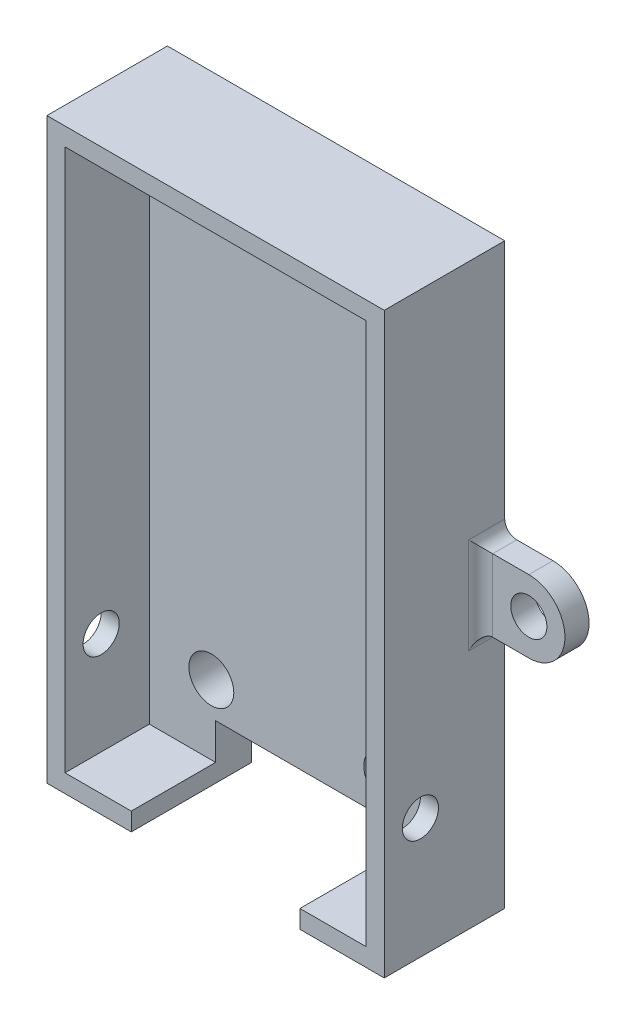
ISO-10303-21;
HEADER;
FILE_DESCRIPTION(('STEP AP214'),'2;1');
FILE_NAME('part.step','',(''),(''),'','','');
FILE_SCHEMA(('AUTOMOTIVE_DESIGN { 1 0 10303 214 1 1 1 1 }'));
ENDSEC;
DATA;
#1=APPLICATION_CONTEXT('core data for automotive mechanical design processes');
#2=APPLICATION_PROTOCOL_DEFINITION('international standard','automotive_design',2000,#1);
#3=PRODUCT_CONTEXT('',#1,'mechanical');
#4=PRODUCT('Part','Part','',(#3));
#5=PRODUCT_RELATED_PRODUCT_CATEGORY('part','',(#4));
#6=PRODUCT_DEFINITION_FORMATION('','',#4);
#7=PRODUCT_DEFINITION_CONTEXT('part definition',#1,'design');
#8=PRODUCT_DEFINITION('design','',#6,#7);
#9=PRODUCT_DEFINITION_SHAPE('','',#8);
#10=(LENGTH_UNIT() NAMED_UNIT(*) SI_UNIT(.MILLI.,.METRE.));
#11=(NAMED_UNIT(*) PLANE_ANGLE_UNIT() SI_UNIT($,.RADIAN.));
#12=(NAMED_UNIT(*) SI_UNIT($,.STERADIAN.) SOLID_ANGLE_UNIT());
#13=UNCERTAINTY_MEASURE_WITH_UNIT(LENGTH_MEASURE(1.E-05),#10,'distance_accuracy_value','');
#14=(GEOMETRIC_REPRESENTATION_CONTEXT(3) GLOBAL_UNCERTAINTY_ASSIGNED_CONTEXT((#13)) GLOBAL_UNIT_ASSIGNED_CONTEXT((#10,
#11,#12)) REPRESENTATION_CONTEXT('',''));
#15=CARTESIAN_POINT('',(0.,0.,0.));
#16=DIRECTION('',(0.,0.,1.));
#17=DIRECTION('',(1.,0.,0.));
#18=AXIS2_PLACEMENT_3D('',#15,#16,#17);
#19=CARTESIAN_POINT('',(0.,0.,3.));
#20=DIRECTION('',(0.,0.,1.));
#21=DIRECTION('',(1.,0.,0.));
#22=AXIS2_PLACEMENT_3D('',#19,#20,#21);
#23=PLANE('',#22);
#24=CARTESIAN_POINT('',(-7.14290536702838,18.0559536422497,3.));
#25=DIRECTION('',(0.,0.,1.));
#26=DIRECTION('',(1.,0.,0.));
#27=AXIS2_PLACEMENT_3D('',#24,#25,#26);
#28=CIRCLE('',#27,1.93973789939432);
#29=CARTESIAN_POINT('',(-5.20316746763407,18.0559536422497,3.));
#30=VERTEX_POINT('',#29);
#31=EDGE_CURVE('E399',#30,#30,#28,.T.);
#32=ORIENTED_EDGE('',*,*,#31,.F.);
#33=EDGE_LOOP('',(#32));
#34=FACE_BOUND('',#33,.T.);
#35=CARTESIAN_POINT('',(-7.35443169670674,-16.736502832513,3.));
#36=DIRECTION('',(0.,0.,1.));
#37=DIRECTION('',(1.,0.,0.));
#38=AXIS2_PLACEMENT_3D('',#35,#36,#37);
#39=CIRCLE('',#38,1.86350117789668);
#40=CARTESIAN_POINT('',(-5.49093051881006,-16.736502832513,3.));
#41=VERTEX_POINT('',#40);
#42=EDGE_CURVE('E411',#41,#41,#39,.T.);
#43=ORIENTED_EDGE('',*,*,#42,.F.);
#44=EDGE_LOOP('',(#43));
#45=FACE_BOUND('',#44,.T.);
#46=CARTESIAN_POINT('',(7.23721130246267,-16.5937434626265,3.));
#47=DIRECTION('',(0.,0.,1.));
#48=DIRECTION('',(1.,0.,0.));
#49=AXIS2_PLACEMENT_3D('',#46,#47,#48);
#50=CIRCLE('',#49,1.93430268976269);
#51=CARTESIAN_POINT('',(9.17151399222536,-16.5937434626265,3.));
#52=VERTEX_POINT('',#51);
#53=EDGE_CURVE('E405',#52,#52,#50,.T.);
#54=ORIENTED_EDGE('',*,*,#53,.F.);
#55=EDGE_LOOP('',(#54));
#56=FACE_BOUND('',#55,.T.);
#57=CARTESIAN_POINT('',(7.32474374533106,18.0085452844177,3.));
#58=DIRECTION('',(0.,0.,1.));
#59=DIRECTION('',(1.,0.,0.));
#60=AXIS2_PLACEMENT_3D('',#57,#58,#59);
#61=CIRCLE('',#60,1.85462720069843);
#62=CARTESIAN_POINT('',(9.17937094602948,18.0085452844177,3.));
#63=VERTEX_POINT('',#62);
#64=EDGE_CURVE('E393',#63,#63,#61,.T.);
#65=ORIENTED_EDGE('',*,*,#64,.F.);
#66=EDGE_LOOP('',(#65));
#67=FACE_BOUND('',#66,.T.);
#68=DIRECTION('',(1.,0.,0.));
#69=VECTOR('',#68,1.);
#70=CARTESIAN_POINT('',(0.,-19.5,3.));
#71=LINE('',#70,#69);
#72=CARTESIAN_POINT('',(-7.,-19.5,3.));
#73=VERTEX_POINT('',#72);
#74=CARTESIAN_POINT('',(7.,-19.5,3.));
#75=VERTEX_POINT('',#74);
#76=EDGE_CURVE('E253',#73,#75,#71,.T.);
#77=ORIENTED_EDGE('',*,*,#76,.T.);
#78=DIRECTION('',(0.,-1.,0.));
#79=VECTOR('',#78,1.);
#80=CARTESIAN_POINT('',(7.,0.,3.));
#81=LINE('',#80,#79);
#82=CARTESIAN_POINT('',(7.,-22.5,3.));
#83=VERTEX_POINT('',#82);
#84=EDGE_CURVE('E238',#75,#83,#81,.T.);
#85=ORIENTED_EDGE('',*,*,#84,.T.);
#86=DIRECTION('',(1.,0.,0.));
#87=VECTOR('',#86,1.);
#88=CARTESIAN_POINT('',(-12.5,-22.5,3.));
#89=LINE('',#88,#87);
#90=CARTESIAN_POINT('',(12.5,-22.5,3.));
#91=VERTEX_POINT('',#90);
#92=EDGE_CURVE('E422',#83,#91,#89,.T.);
#93=ORIENTED_EDGE('',*,*,#92,.T.);
#94=DIRECTION('',(0.,1.,0.));
#95=VECTOR('',#94,1.);
#96=CARTESIAN_POINT('',(12.5,22.5,3.));
#97=LINE('',#96,#95);
#98=CARTESIAN_POINT('',(12.5,22.5,3.));
#99=VERTEX_POINT('',#98);
#100=EDGE_CURVE('E414',#91,#99,#97,.T.);
#101=ORIENTED_EDGE('',*,*,#100,.T.);
#102=DIRECTION('',(-1.,0.,0.));
#103=VECTOR('',#102,1.);
#104=CARTESIAN_POINT('',(-12.5,22.5,3.));
#105=LINE('',#104,#103);
#106=CARTESIAN_POINT('',(-12.5,22.5,3.));
#107=VERTEX_POINT('',#106);
#108=EDGE_CURVE('E418',#99,#107,#105,.T.);
#109=ORIENTED_EDGE('',*,*,#108,.T.);
#110=DIRECTION('',(0.,-1.,0.));
#111=VECTOR('',#110,1.);
#112=CARTESIAN_POINT('',(-12.5,22.5,3.));
#113=LINE('',#112,#111);
#114=CARTESIAN_POINT('',(-12.5,-22.5,3.));
#115=VERTEX_POINT('',#114);
#116=EDGE_CURVE('E420',#107,#115,#113,.T.);
#117=ORIENTED_EDGE('',*,*,#116,.T.);
#118=CARTESIAN_POINT('',(-7.,-22.5,3.));
#119=VERTEX_POINT('',#118);
#120=EDGE_CURVE('E423',#115,#119,#89,.T.);
#121=ORIENTED_EDGE('',*,*,#120,.T.);
#122=DIRECTION('',(0.,1.,0.));
#123=VECTOR('',#122,1.);
#124=CARTESIAN_POINT('',(-7.,0.,3.));
#125=LINE('',#124,#123);
#126=EDGE_CURVE('E241',#119,#73,#125,.T.);
#127=ORIENTED_EDGE('',*,*,#126,.T.);
#128=EDGE_LOOP('',(#77,#85,#93,#101,#109,#117,#121,#127));
#129=FACE_BOUND('',#128,.T.);
#130=ADVANCED_FACE('F46',(#34,#45,#56,#67,#129),#23,.T.);
#131=CARTESIAN_POINT('',(0.,0.,0.));
#132=DIRECTION('',(0.,0.,1.));
#133=DIRECTION('',(1.,0.,0.));
#134=AXIS2_PLACEMENT_3D('',#131,#132,#133);
#135=PLANE('',#134);
#136=CARTESIAN_POINT('',(18.,0.,0.));
#137=DIRECTION('',(0.,0.,1.));
#138=DIRECTION('',(-1.,0.,0.));
#139=AXIS2_PLACEMENT_3D('',#136,#137,#138);
#140=CIRCLE('',#139,1.5);
#141=CARTESIAN_POINT('',(16.5,0.,0.));
#142=VERTEX_POINT('',#141);
#143=EDGE_CURVE('E260',#142,#142,#140,.T.);
#144=ORIENTED_EDGE('',*,*,#143,.T.);
#145=EDGE_LOOP('',(#144));
#146=FACE_BOUND('',#145,.T.);
#147=CARTESIAN_POINT('',(-18.,0.,0.));
#148=DIRECTION('',(0.,0.,1.));
#149=DIRECTION('',(1.,0.,0.));
#150=AXIS2_PLACEMENT_3D('',#147,#148,#149);
#151=CIRCLE('',#150,1.5);
#152=CARTESIAN_POINT('',(-16.5,0.,0.));
#153=VERTEX_POINT('',#152);
#154=EDGE_CURVE('E285',#153,#153,#151,.T.);
#155=ORIENTED_EDGE('',*,*,#154,.T.);
#156=EDGE_LOOP('',(#155));
#157=FACE_BOUND('',#156,.T.);
#158=CARTESIAN_POINT('',(7.32474374533106,18.0085452844177,0.));
#159=DIRECTION('',(0.,0.,1.));
#160=DIRECTION('',(1.,0.,0.));
#161=AXIS2_PLACEMENT_3D('',#158,#159,#160);
#162=CIRCLE('',#161,1.85462720069843);
#163=CARTESIAN_POINT('',(9.17937094602948,18.0085452844177,0.));
#164=VERTEX_POINT('',#163);
#165=EDGE_CURVE('E392',#164,#164,#162,.T.);
#166=ORIENTED_EDGE('',*,*,#165,.T.);
#167=EDGE_LOOP('',(#166));
#168=FACE_BOUND('',#167,.T.);
#169=CARTESIAN_POINT('',(-7.14290536702838,18.0559536422497,0.));
#170=DIRECTION('',(0.,0.,1.));
#171=DIRECTION('',(1.,0.,0.));
#172=AXIS2_PLACEMENT_3D('',#169,#170,#171);
#173=CIRCLE('',#172,1.93973789939432);
#174=CARTESIAN_POINT('',(-5.20316746763407,18.0559536422497,0.));
#175=VERTEX_POINT('',#174);
#176=EDGE_CURVE('E396',#175,#175,#173,.T.);
#177=ORIENTED_EDGE('',*,*,#176,.T.);
#178=EDGE_LOOP('',(#177));
#179=FACE_BOUND('',#178,.T.);
#180=CARTESIAN_POINT('',(7.23721130246267,-16.5937434626265,0.));
#181=DIRECTION('',(0.,0.,1.));
#182=DIRECTION('',(1.,0.,0.));
#183=AXIS2_PLACEMENT_3D('',#180,#181,#182);
#184=CIRCLE('',#183,1.93430268976269);
#185=CARTESIAN_POINT('',(9.17151399222536,-16.5937434626265,0.));
#186=VERTEX_POINT('',#185);
#187=EDGE_CURVE('E402',#186,#186,#184,.T.);
#188=ORIENTED_EDGE('',*,*,#187,.T.);
#189=EDGE_LOOP('',(#188));
#190=FACE_BOUND('',#189,.T.);
#191=CARTESIAN_POINT('',(-7.35443169670674,-16.736502832513,0.));
#192=DIRECTION('',(0.,0.,1.));
#193=DIRECTION('',(1.,0.,0.));
#194=AXIS2_PLACEMENT_3D('',#191,#192,#193);
#195=CIRCLE('',#194,1.86350117789668);
#196=CARTESIAN_POINT('',(-5.49093051881006,-16.736502832513,0.));
#197=VERTEX_POINT('',#196);
#198=EDGE_CURVE('E408',#197,#197,#195,.T.);
#199=ORIENTED_EDGE('',*,*,#198,.T.);
#200=EDGE_LOOP('',(#199));
#201=FACE_BOUND('',#200,.T.);
#202=DIRECTION('',(0.,-1.,0.));
#203=VECTOR('',#202,1.);
#204=CARTESIAN_POINT('',(7.,-22.5,0.));
#205=LINE('',#204,#203);
#206=CARTESIAN_POINT('',(7.,-19.5,0.));
#207=VERTEX_POINT('',#206);
#208=CARTESIAN_POINT('',(7.,-24.,0.));
#209=VERTEX_POINT('',#208);
#210=EDGE_CURVE('E221',#207,#209,#205,.T.);
#211=ORIENTED_EDGE('',*,*,#210,.F.);
#212=DIRECTION('',(-1.,0.,0.));
#213=VECTOR('',#212,1.);
#214=CARTESIAN_POINT('',(-7.,-19.5,0.));
#215=LINE('',#214,#213);
#216=CARTESIAN_POINT('',(-7.,-19.5,0.));
#217=VERTEX_POINT('',#216);
#218=EDGE_CURVE('E226',#207,#217,#215,.T.);
#219=ORIENTED_EDGE('',*,*,#218,.T.);
#220=DIRECTION('',(0.,1.,0.));
#221=VECTOR('',#220,1.);
#222=CARTESIAN_POINT('',(-7.,-22.5,0.));
#223=LINE('',#222,#221);
#224=CARTESIAN_POINT('',(-7.,-24.,0.));
#225=VERTEX_POINT('',#224);
#226=EDGE_CURVE('E322',#225,#217,#223,.T.);
#227=ORIENTED_EDGE('',*,*,#226,.F.);
#228=DIRECTION('',(1.,0.,0.));
#229=VECTOR('',#228,1.);
#230=CARTESIAN_POINT('',(-14.,-24.,0.));
#231=LINE('',#230,#229);
#232=CARTESIAN_POINT('',(-14.,-24.,0.));
#233=VERTEX_POINT('',#232);
#234=EDGE_CURVE('E356',#233,#225,#231,.T.);
#235=ORIENTED_EDGE('',*,*,#234,.F.);
#236=DIRECTION('',(0.,-1.,0.));
#237=VECTOR('',#236,1.);
#238=CARTESIAN_POINT('',(-14.,24.,0.));
#239=LINE('',#238,#237);
#240=CARTESIAN_POINT('',(-14.,-4.,0.));
#241=VERTEX_POINT('',#240);
#242=EDGE_CURVE('E352',#241,#233,#239,.T.);
#243=ORIENTED_EDGE('',*,*,#242,.F.);
#244=CARTESIAN_POINT('',(-15.,-4.,0.));
#245=DIRECTION('',(0.,0.,1.));
#246=DIRECTION('',(1.,0.,0.));
#247=AXIS2_PLACEMENT_3D('',#244,#245,#246);
#248=CIRCLE('',#247,1.);
#249=CARTESIAN_POINT('',(-15.,-3.,0.));
#250=VERTEX_POINT('',#249);
#251=EDGE_CURVE('E13',#241,#250,#248,.T.);
#252=ORIENTED_EDGE('',*,*,#251,.T.);
#253=DIRECTION('',(1.,0.,0.));
#254=VECTOR('',#253,1.);
#255=CARTESIAN_POINT('',(-18.,-3.,0.));
#256=LINE('',#255,#254);
#257=CARTESIAN_POINT('',(-18.,-3.,0.));
#258=VERTEX_POINT('',#257);
#259=EDGE_CURVE('E295',#258,#250,#256,.T.);
#260=ORIENTED_EDGE('',*,*,#259,.F.);
#261=CARTESIAN_POINT('',(-18.,0.,0.));
#262=DIRECTION('',(0.,0.,1.));
#263=DIRECTION('',(1.,0.,0.));
#264=AXIS2_PLACEMENT_3D('',#261,#262,#263);
#265=CIRCLE('',#264,3.);
#266=CARTESIAN_POINT('',(-18.,3.,0.));
#267=VERTEX_POINT('',#266);
#268=EDGE_CURVE('E301',#267,#258,#265,.T.);
#269=ORIENTED_EDGE('',*,*,#268,.F.);
#270=DIRECTION('',(-1.,0.,0.));
#271=VECTOR('',#270,1.);
#272=CARTESIAN_POINT('',(-14.,3.,0.));
#273=LINE('',#272,#271);
#274=CARTESIAN_POINT('',(-15.,3.,0.));
#275=VERTEX_POINT('',#274);
#276=EDGE_CURVE('E289',#275,#267,#273,.T.);
#277=ORIENTED_EDGE('',*,*,#276,.F.);
#278=CARTESIAN_POINT('',(-15.,4.,0.));
#279=DIRECTION('',(0.,0.,1.));
#280=DIRECTION('',(1.,0.,0.));
#281=AXIS2_PLACEMENT_3D('',#278,#279,#280);
#282=CIRCLE('',#281,1.);
#283=CARTESIAN_POINT('',(-14.,4.,0.));
#284=VERTEX_POINT('',#283);
#285=EDGE_CURVE('E55',#275,#284,#282,.T.);
#286=ORIENTED_EDGE('',*,*,#285,.T.);
#287=CARTESIAN_POINT('',(-14.,24.,0.));
#288=VERTEX_POINT('',#287);
#289=EDGE_CURVE('E353',#288,#284,#239,.T.);
#290=ORIENTED_EDGE('',*,*,#289,.F.);
#291=DIRECTION('',(-1.,0.,0.));
#292=VECTOR('',#291,1.);
#293=CARTESIAN_POINT('',(14.,24.,0.));
#294=LINE('',#293,#292);
#295=CARTESIAN_POINT('',(14.,24.,0.));
#296=VERTEX_POINT('',#295);
#297=EDGE_CURVE('E350',#296,#288,#294,.T.);
#298=ORIENTED_EDGE('',*,*,#297,.F.);
#299=DIRECTION('',(0.,1.,0.));
#300=VECTOR('',#299,1.);
#301=CARTESIAN_POINT('',(14.,-24.,0.));
#302=LINE('',#301,#300);
#303=CARTESIAN_POINT('',(14.,3.99999999999997,0.));
#304=VERTEX_POINT('',#303);
#305=EDGE_CURVE('E346',#304,#296,#302,.T.);
#306=ORIENTED_EDGE('',*,*,#305,.F.);
#307=CARTESIAN_POINT('',(15.,3.99999999999997,0.));
#308=DIRECTION('',(0.,0.,1.));
#309=DIRECTION('',(1.,0.,0.));
#310=AXIS2_PLACEMENT_3D('',#307,#308,#309);
#311=CIRCLE('',#310,1.);
#312=CARTESIAN_POINT('',(15.,2.99999999999997,0.));
#313=VERTEX_POINT('',#312);
#314=EDGE_CURVE('E453',#304,#313,#311,.T.);
#315=ORIENTED_EDGE('',*,*,#314,.T.);
#316=DIRECTION('',(-1.,0.,0.));
#317=VECTOR('',#316,1.);
#318=CARTESIAN_POINT('',(14.,2.99999999999997,0.));
#319=LINE('',#318,#317);
#320=CARTESIAN_POINT('',(18.,2.99999999999997,0.));
#321=VERTEX_POINT('',#320);
#322=EDGE_CURVE('E276',#321,#313,#319,.T.);
#323=ORIENTED_EDGE('',*,*,#322,.F.);
#324=CARTESIAN_POINT('',(18.,0.,0.));
#325=DIRECTION('',(0.,0.,1.));
#326=DIRECTION('',(-1.,0.,0.));
#327=AXIS2_PLACEMENT_3D('',#324,#325,#326);
#328=CIRCLE('',#327,2.99999999999999);
#329=CARTESIAN_POINT('',(18.,-3.00000000000001,0.));
#330=VERTEX_POINT('',#329);
#331=EDGE_CURVE('E259',#330,#321,#328,.T.);
#332=ORIENTED_EDGE('',*,*,#331,.F.);
#333=DIRECTION('',(1.,0.,0.));
#334=VECTOR('',#333,1.);
#335=CARTESIAN_POINT('',(18.,-3.00000000000001,0.));
#336=LINE('',#335,#334);
#337=CARTESIAN_POINT('',(15.,-3.00000000000001,0.));
#338=VERTEX_POINT('',#337);
#339=EDGE_CURVE('E268',#338,#330,#336,.T.);
#340=ORIENTED_EDGE('',*,*,#339,.F.);
#341=CARTESIAN_POINT('',(15.,-4.00000000000001,0.));
#342=DIRECTION('',(0.,0.,1.));
#343=DIRECTION('',(1.,0.,0.));
#344=AXIS2_PLACEMENT_3D('',#341,#342,#343);
#345=CIRCLE('',#344,1.);
#346=CARTESIAN_POINT('',(14.,-4.00000000000001,0.));
#347=VERTEX_POINT('',#346);
#348=EDGE_CURVE('E455',#338,#347,#345,.T.);
#349=ORIENTED_EDGE('',*,*,#348,.T.);
#350=CARTESIAN_POINT('',(14.,-24.,0.));
#351=VERTEX_POINT('',#350);
#352=EDGE_CURVE('E347',#351,#347,#302,.T.);
#353=ORIENTED_EDGE('',*,*,#352,.F.);
#354=DIRECTION('',(1.,0.,0.));
#355=VECTOR('',#354,1.);
#356=CARTESIAN_POINT('',(7.,-24.,0.));
#357=LINE('',#356,#355);
#358=EDGE_CURVE('E228',#209,#351,#357,.T.);
#359=ORIENTED_EDGE('',*,*,#358,.F.);
#360=EDGE_LOOP('',(#211,#219,#227,#235,#243,#252,#260,#269,#277,#286,#290,#298,#306,#315,#323,
#332,#340,#349,#353,#359));
#361=FACE_BOUND('',#360,.T.);
#362=ADVANCED_FACE('F223',(#146,#157,#168,#179,#190,#201,#361),#135,.F.);
#363=CARTESIAN_POINT('',(14.,-24.,10.));
#364=DIRECTION('',(-1.,0.,0.));
#365=DIRECTION('',(0.,-1.,0.));
#366=AXIS2_PLACEMENT_3D('',#363,#364,#365);
#367=PLANE('',#366);
#368=CARTESIAN_POINT('',(14.,-14.,7.));
#369=DIRECTION('',(1.,0.,0.));
#370=DIRECTION('',(0.,0.,-1.));
#371=AXIS2_PLACEMENT_3D('',#368,#369,#370);
#372=CIRCLE('',#371,1.5);
#373=CARTESIAN_POINT('',(14.,-14.,5.5));
#374=VERTEX_POINT('',#373);
#375=EDGE_CURVE('E309',#374,#374,#372,.T.);
#376=ORIENTED_EDGE('',*,*,#375,.F.);
#377=EDGE_LOOP('',(#376));
#378=FACE_BOUND('',#377,.T.);
#379=DIRECTION('',(0.,-1.,0.));
#380=VECTOR('',#379,1.);
#381=CARTESIAN_POINT('',(14.,2.99999999999997,3.));
#382=LINE('',#381,#380);
#383=CARTESIAN_POINT('',(14.,-4.00000000000001,3.));
#384=VERTEX_POINT('',#383);
#385=CARTESIAN_POINT('',(14.,3.99999999999997,3.));
#386=VERTEX_POINT('',#385);
#387=EDGE_CURVE('E430',#384,#386,#382,.F.);
#388=ORIENTED_EDGE('',*,*,#387,.T.);
#389=DIRECTION('',(0.,0.,-1.));
#390=VECTOR('',#389,1.);
#391=CARTESIAN_POINT('',(14.,3.99999999999997,0.));
#392=LINE('',#391,#390);
#393=EDGE_CURVE('E432',#386,#304,#392,.T.);
#394=ORIENTED_EDGE('',*,*,#393,.T.);
#395=ORIENTED_EDGE('',*,*,#305,.T.);
#396=DIRECTION('',(0.,0.,-1.));
#397=VECTOR('',#396,1.);
#398=CARTESIAN_POINT('',(14.,24.,10.));
#399=LINE('',#398,#397);
#400=CARTESIAN_POINT('',(14.,24.,10.));
#401=VERTEX_POINT('',#400);
#402=EDGE_CURVE('E379',#401,#296,#399,.T.);
#403=ORIENTED_EDGE('',*,*,#402,.F.);
#404=DIRECTION('',(0.,1.,0.));
#405=VECTOR('',#404,1.);
#406=CARTESIAN_POINT('',(14.,-24.,10.));
#407=LINE('',#406,#405);
#408=CARTESIAN_POINT('',(14.,-24.,10.));
#409=VERTEX_POINT('',#408);
#410=EDGE_CURVE('E328',#409,#401,#407,.T.);
#411=ORIENTED_EDGE('',*,*,#410,.F.);
#412=DIRECTION('',(0.,0.,-1.));
#413=VECTOR('',#412,1.);
#414=CARTESIAN_POINT('',(14.,-24.,10.));
#415=LINE('',#414,#413);
#416=EDGE_CURVE('E382',#409,#351,#415,.T.);
#417=ORIENTED_EDGE('',*,*,#416,.T.);
#418=ORIENTED_EDGE('',*,*,#352,.T.);
#419=DIRECTION('',(0.,0.,-1.));
#420=VECTOR('',#419,1.);
#421=CARTESIAN_POINT('',(14.,-4.00000000000001,2.));
#422=LINE('',#421,#420);
#423=EDGE_CURVE('E426',#347,#384,#422,.F.);
#424=ORIENTED_EDGE('',*,*,#423,.T.);
#425=EDGE_LOOP('',(#388,#394,#395,#403,#411,#417,#418,#424));
#426=FACE_BOUND('',#425,.T.);
#427=ADVANCED_FACE('F529',(#378,#426),#367,.F.);
#428=CARTESIAN_POINT('',(-14.,24.,10.));
#429=DIRECTION('',(1.,0.,0.));
#430=DIRECTION('',(0.,1.,0.));
#431=AXIS2_PLACEMENT_3D('',#428,#429,#430);
#432=PLANE('',#431);
#433=ORIENTED_EDGE('',*,*,#289,.T.);
#434=DIRECTION('',(0.,0.,-1.));
#435=VECTOR('',#434,1.);
#436=CARTESIAN_POINT('',(-14.,4.,2.));
#437=LINE('',#436,#435);
#438=CARTESIAN_POINT('',(-14.,4.,3.));
#439=VERTEX_POINT('',#438);
#440=EDGE_CURVE('E448',#284,#439,#437,.F.);
#441=ORIENTED_EDGE('',*,*,#440,.T.);
#442=DIRECTION('',(0.,1.,0.));
#443=VECTOR('',#442,1.);
#444=CARTESIAN_POINT('',(-14.,24.,3.));
#445=LINE('',#444,#443);
#446=CARTESIAN_POINT('',(-14.,-4.,3.));
#447=VERTEX_POINT('',#446);
#448=EDGE_CURVE('E444',#439,#447,#445,.F.);
#449=ORIENTED_EDGE('',*,*,#448,.T.);
#450=DIRECTION('',(0.,0.,-1.));
#451=VECTOR('',#450,1.);
#452=CARTESIAN_POINT('',(-14.,-4.,0.));
#453=LINE('',#452,#451);
#454=EDGE_CURVE('E446',#447,#241,#453,.T.);
#455=ORIENTED_EDGE('',*,*,#454,.T.);
#456=ORIENTED_EDGE('',*,*,#242,.T.);
#457=DIRECTION('',(0.,0.,-1.));
#458=VECTOR('',#457,1.);
#459=CARTESIAN_POINT('',(-14.,-24.,10.));
#460=LINE('',#459,#458);
#461=CARTESIAN_POINT('',(-14.,-24.,10.));
#462=VERTEX_POINT('',#461);
#463=EDGE_CURVE('E373',#462,#233,#460,.T.);
#464=ORIENTED_EDGE('',*,*,#463,.F.);
#465=DIRECTION('',(0.,-1.,0.));
#466=VECTOR('',#465,1.);
#467=CARTESIAN_POINT('',(-14.,24.,10.));
#468=LINE('',#467,#466);
#469=CARTESIAN_POINT('',(-14.,24.,10.));
#470=VERTEX_POINT('',#469);
#471=EDGE_CURVE('E332',#470,#462,#468,.T.);
#472=ORIENTED_EDGE('',*,*,#471,.F.);
#473=DIRECTION('',(0.,0.,-1.));
#474=VECTOR('',#473,1.);
#475=CARTESIAN_POINT('',(-14.,24.,10.));
#476=LINE('',#475,#474);
#477=EDGE_CURVE('E376',#470,#288,#476,.T.);
#478=ORIENTED_EDGE('',*,*,#477,.T.);
#479=EDGE_LOOP('',(#433,#441,#449,#455,#456,#464,#472,#478));
#480=FACE_BOUND('',#479,.T.);
#481=CARTESIAN_POINT('',(-14.,-14.,7.));
#482=DIRECTION('',(1.,0.,0.));
#483=DIRECTION('',(0.,0.,-1.));
#484=AXIS2_PLACEMENT_3D('',#481,#482,#483);
#485=CIRCLE('',#484,1.5);
#486=CARTESIAN_POINT('',(-14.,-14.,5.5));
#487=VERTEX_POINT('',#486);
#488=EDGE_CURVE('E312',#487,#487,#485,.T.);
#489=ORIENTED_EDGE('',*,*,#488,.T.);
#490=EDGE_LOOP('',(#489));
#491=FACE_BOUND('',#490,.T.);
#492=ADVANCED_FACE('F476',(#480,#491),#432,.F.);
#493=CARTESIAN_POINT('',(-7.35443169670674,-16.736502832513,3.));
#494=DIRECTION('',(0.,0.,-1.));
#495=DIRECTION('',(-1.,0.,0.));
#496=AXIS2_PLACEMENT_3D('',#493,#494,#495);
#497=CYLINDRICAL_SURFACE('',#496,1.86350117789668);
#498=ORIENTED_EDGE('',*,*,#42,.T.);
#499=EDGE_LOOP('',(#498));
#500=FACE_BOUND('',#499,.T.);
#501=ORIENTED_EDGE('',*,*,#198,.F.);
#502=EDGE_LOOP('',(#501));
#503=FACE_BOUND('',#502,.T.);
#504=ADVANCED_FACE('F535',(#500,#503),#497,.F.);
#505=CARTESIAN_POINT('',(7.23721130246267,-16.5937434626265,3.));
#506=DIRECTION('',(0.,0.,-1.));
#507=DIRECTION('',(-1.,0.,0.));
#508=AXIS2_PLACEMENT_3D('',#505,#506,#507);
#509=CYLINDRICAL_SURFACE('',#508,1.93430268976269);
#510=ORIENTED_EDGE('',*,*,#53,.T.);
#511=EDGE_LOOP('',(#510));
#512=FACE_BOUND('',#511,.T.);
#513=ORIENTED_EDGE('',*,*,#187,.F.);
#514=EDGE_LOOP('',(#513));
#515=FACE_BOUND('',#514,.T.);
#516=ADVANCED_FACE('F824',(#512,#515),#509,.F.);
#517=CARTESIAN_POINT('',(-7.14290536702838,18.0559536422497,3.));
#518=DIRECTION('',(0.,0.,-1.));
#519=DIRECTION('',(-1.,0.,0.));
#520=AXIS2_PLACEMENT_3D('',#517,#518,#519);
#521=CYLINDRICAL_SURFACE('',#520,1.93973789939432);
#522=ORIENTED_EDGE('',*,*,#31,.T.);
#523=EDGE_LOOP('',(#522));
#524=FACE_BOUND('',#523,.T.);
#525=ORIENTED_EDGE('',*,*,#176,.F.);
#526=EDGE_LOOP('',(#525));
#527=FACE_BOUND('',#526,.T.);
#528=ADVANCED_FACE('F821',(#524,#527),#521,.F.);
#529=CARTESIAN_POINT('',(7.32474374533106,18.0085452844177,3.));
#530=DIRECTION('',(0.,0.,-1.));
#531=DIRECTION('',(-1.,0.,0.));
#532=AXIS2_PLACEMENT_3D('',#529,#530,#531);
#533=CYLINDRICAL_SURFACE('',#532,1.85462720069843);
#534=ORIENTED_EDGE('',*,*,#64,.T.);
#535=EDGE_LOOP('',(#534));
#536=FACE_BOUND('',#535,.T.);
#537=ORIENTED_EDGE('',*,*,#165,.F.);
#538=EDGE_LOOP('',(#537));
#539=FACE_BOUND('',#538,.T.);
#540=ADVANCED_FACE('F817',(#536,#539),#533,.F.);
#541=CARTESIAN_POINT('',(12.5,-22.5,10.));
#542=DIRECTION('',(1.,0.,0.));
#543=DIRECTION('',(0.,1.,0.));
#544=AXIS2_PLACEMENT_3D('',#541,#542,#543);
#545=PLANE('',#544);
#546=CARTESIAN_POINT('',(12.5,-14.,7.));
#547=DIRECTION('',(1.,0.,0.));
#548=DIRECTION('',(0.,1.,0.));
#549=AXIS2_PLACEMENT_3D('',#546,#547,#548);
#550=CIRCLE('',#549,1.5);
#551=CARTESIAN_POINT('',(12.5,-12.5,7.));
#552=VERTEX_POINT('',#551);
#553=EDGE_CURVE('E232',#552,#552,#550,.T.);
#554=ORIENTED_EDGE('',*,*,#553,.T.);
#555=EDGE_LOOP('',(#554));
#556=FACE_BOUND('',#555,.T.);
#557=ORIENTED_EDGE('',*,*,#100,.F.);
#558=DIRECTION('',(0.,0.,-1.));
#559=VECTOR('',#558,1.);
#560=CARTESIAN_POINT('',(12.5,-22.5,10.));
#561=LINE('',#560,#559);
#562=CARTESIAN_POINT('',(12.5,-22.5,10.));
#563=VERTEX_POINT('',#562);
#564=EDGE_CURVE('E389',#563,#91,#561,.T.);
#565=ORIENTED_EDGE('',*,*,#564,.F.);
#566=DIRECTION('',(0.,-1.,0.));
#567=VECTOR('',#566,1.);
#568=CARTESIAN_POINT('',(12.5,-22.5,10.));
#569=LINE('',#568,#567);
#570=CARTESIAN_POINT('',(12.5,22.5,10.));
#571=VERTEX_POINT('',#570);
#572=EDGE_CURVE('E318',#571,#563,#569,.T.);
#573=ORIENTED_EDGE('',*,*,#572,.F.);
#574=DIRECTION('',(0.,0.,-1.));
#575=VECTOR('',#574,1.);
#576=CARTESIAN_POINT('',(12.5,22.5,10.));
#577=LINE('',#576,#575);
#578=EDGE_CURVE('E343',#571,#99,#577,.T.);
#579=ORIENTED_EDGE('',*,*,#578,.T.);
#580=EDGE_LOOP('',(#557,#565,#573,#579));
#581=FACE_BOUND('',#580,.T.);
#582=ADVANCED_FACE('F676',(#556,#581),#545,.F.);
#583=CARTESIAN_POINT('',(7.,-22.5,10.));
#584=DIRECTION('',(0.,-1.,0.));
#585=DIRECTION('',(1.,0.,0.));
#586=AXIS2_PLACEMENT_3D('',#583,#584,#585);
#587=PLANE('',#586);
#588=ORIENTED_EDGE('',*,*,#92,.F.);
#589=DIRECTION('',(0.,0.,-1.));
#590=VECTOR('',#589,1.);
#591=CARTESIAN_POINT('',(7.,-22.5,10.));
#592=LINE('',#591,#590);
#593=CARTESIAN_POINT('',(7.,-22.5,10.));
#594=VERTEX_POINT('',#593);
#595=EDGE_CURVE('E387',#594,#83,#592,.T.);
#596=ORIENTED_EDGE('',*,*,#595,.F.);
#597=DIRECTION('',(-1.,0.,0.));
#598=VECTOR('',#597,1.);
#599=CARTESIAN_POINT('',(7.,-22.5,10.));
#600=LINE('',#599,#598);
#601=EDGE_CURVE('E321',#563,#594,#600,.T.);
#602=ORIENTED_EDGE('',*,*,#601,.F.);
#603=ORIENTED_EDGE('',*,*,#564,.T.);
#604=EDGE_LOOP('',(#588,#596,#602,#603));
#605=FACE_BOUND('',#604,.T.);
#606=ADVANCED_FACE('F671',(#605),#587,.F.);
#607=CARTESIAN_POINT('',(7.,-22.5,10.));
#608=DIRECTION('',(1.,0.,0.));
#609=DIRECTION('',(0.,1.,0.));
#610=AXIS2_PLACEMENT_3D('',#607,#608,#609);
#611=PLANE('',#610);
#612=ORIENTED_EDGE('',*,*,#210,.T.);
#613=DIRECTION('',(0.,0.,-1.));
#614=VECTOR('',#613,1.);
#615=CARTESIAN_POINT('',(7.,-24.,10.));
#616=LINE('',#615,#614);
#617=CARTESIAN_POINT('',(7.,-24.,10.));
#618=VERTEX_POINT('',#617);
#619=EDGE_CURVE('E385',#618,#209,#616,.T.);
#620=ORIENTED_EDGE('',*,*,#619,.F.);
#621=DIRECTION('',(0.,-1.,0.));
#622=VECTOR('',#621,1.);
#623=CARTESIAN_POINT('',(7.,-22.5,10.));
#624=LINE('',#623,#622);
#625=EDGE_CURVE('E324',#594,#618,#624,.T.);
#626=ORIENTED_EDGE('',*,*,#625,.F.);
#627=ORIENTED_EDGE('',*,*,#595,.T.);
#628=ORIENTED_EDGE('',*,*,#84,.F.);
#629=DIRECTION('',(0.,0.,-1.));
#630=VECTOR('',#629,1.);
#631=CARTESIAN_POINT('',(7.,-19.5,10.));
#632=LINE('',#631,#630);
#633=EDGE_CURVE('E235',#75,#207,#632,.T.);
#634=ORIENTED_EDGE('',*,*,#633,.T.);
#635=EDGE_LOOP('',(#612,#620,#626,#627,#628,#634));
#636=FACE_BOUND('',#635,.T.);
#637=ADVANCED_FACE('F236',(#636),#611,.F.);
#638=CARTESIAN_POINT('',(7.,-24.,10.));
#639=DIRECTION('',(0.,1.,0.));
#640=DIRECTION('',(0.,0.,1.));
#641=AXIS2_PLACEMENT_3D('',#638,#639,#640);
#642=PLANE('',#641);
#643=ORIENTED_EDGE('',*,*,#358,.T.);
#644=ORIENTED_EDGE('',*,*,#416,.F.);
#645=DIRECTION('',(1.,0.,0.));
#646=VECTOR('',#645,1.);
#647=CARTESIAN_POINT('',(7.,-24.,10.));
#648=LINE('',#647,#646);
#649=EDGE_CURVE('E326',#618,#409,#648,.T.);
#650=ORIENTED_EDGE('',*,*,#649,.F.);
#651=ORIENTED_EDGE('',*,*,#619,.T.);
#652=EDGE_LOOP('',(#643,#644,#650,#651));
#653=FACE_BOUND('',#652,.T.);
#654=ADVANCED_FACE('F689',(#653),#642,.F.);
#655=CARTESIAN_POINT('',(14.,24.,10.));
#656=DIRECTION('',(0.,-1.,0.));
#657=DIRECTION('',(0.,0.,-1.));
#658=AXIS2_PLACEMENT_3D('',#655,#656,#657);
#659=PLANE('',#658);
#660=ORIENTED_EDGE('',*,*,#297,.T.);
#661=ORIENTED_EDGE('',*,*,#477,.F.);
#662=DIRECTION('',(-1.,0.,0.));
#663=VECTOR('',#662,1.);
#664=CARTESIAN_POINT('',(14.,24.,10.));
#665=LINE('',#664,#663);
#666=EDGE_CURVE('E330',#401,#470,#665,.T.);
#667=ORIENTED_EDGE('',*,*,#666,.F.);
#668=ORIENTED_EDGE('',*,*,#402,.T.);
#669=EDGE_LOOP('',(#660,#661,#667,#668));
#670=FACE_BOUND('',#669,.T.);
#671=ADVANCED_FACE('F810',(#670),#659,.F.);
#672=CARTESIAN_POINT('',(-14.,-24.,10.));
#673=DIRECTION('',(0.,1.,0.));
#674=DIRECTION('',(-1.,0.,0.));
#675=AXIS2_PLACEMENT_3D('',#672,#673,#674);
#676=PLANE('',#675);
#677=ORIENTED_EDGE('',*,*,#234,.T.);
#678=DIRECTION('',(0.,0.,-1.));
#679=VECTOR('',#678,1.);
#680=CARTESIAN_POINT('',(-7.,-24.,10.));
#681=LINE('',#680,#679);
#682=CARTESIAN_POINT('',(-7.,-24.,10.));
#683=VERTEX_POINT('',#682);
#684=EDGE_CURVE('E370',#683,#225,#681,.T.);
#685=ORIENTED_EDGE('',*,*,#684,.F.);
#686=DIRECTION('',(1.,0.,0.));
#687=VECTOR('',#686,1.);
#688=CARTESIAN_POINT('',(-14.,-24.,10.));
#689=LINE('',#688,#687);
#690=EDGE_CURVE('E334',#462,#683,#689,.T.);
#691=ORIENTED_EDGE('',*,*,#690,.F.);
#692=ORIENTED_EDGE('',*,*,#463,.T.);
#693=EDGE_LOOP('',(#677,#685,#691,#692));
#694=FACE_BOUND('',#693,.T.);
#695=ADVANCED_FACE('F482',(#694),#676,.F.);
#696=CARTESIAN_POINT('',(-7.,-22.5,10.));
#697=DIRECTION('',(-1.,0.,0.));
#698=DIRECTION('',(0.,-1.,0.));
#699=AXIS2_PLACEMENT_3D('',#696,#697,#698);
#700=PLANE('',#699);
#701=ORIENTED_EDGE('',*,*,#226,.T.);
#702=DIRECTION('',(0.,0.,-1.));
#703=VECTOR('',#702,1.);
#704=CARTESIAN_POINT('',(-7.,-19.5,10.));
#705=LINE('',#704,#703);
#706=EDGE_CURVE('E242',#73,#217,#705,.T.);
#707=ORIENTED_EDGE('',*,*,#706,.F.);
#708=ORIENTED_EDGE('',*,*,#126,.F.);
#709=DIRECTION('',(0.,0.,-1.));
#710=VECTOR('',#709,1.);
#711=CARTESIAN_POINT('',(-7.,-22.5,10.));
#712=LINE('',#711,#710);
#713=CARTESIAN_POINT('',(-7.,-22.5,10.));
#714=VERTEX_POINT('',#713);
#715=EDGE_CURVE('E367',#714,#119,#712,.T.);
#716=ORIENTED_EDGE('',*,*,#715,.F.);
#717=DIRECTION('',(0.,1.,0.));
#718=VECTOR('',#717,1.);
#719=CARTESIAN_POINT('',(-7.,-22.5,10.));
#720=LINE('',#719,#718);
#721=EDGE_CURVE('E336',#683,#714,#720,.T.);
#722=ORIENTED_EDGE('',*,*,#721,.F.);
#723=ORIENTED_EDGE('',*,*,#684,.T.);
#724=EDGE_LOOP('',(#701,#707,#708,#716,#722,#723));
#725=FACE_BOUND('',#724,.T.);
#726=ADVANCED_FACE('F486',(#725),#700,.F.);
#727=CARTESIAN_POINT('',(-12.5,-22.5,10.));
#728=DIRECTION('',(0.,-1.,0.));
#729=DIRECTION('',(1.,0.,0.));
#730=AXIS2_PLACEMENT_3D('',#727,#728,#729);
#731=PLANE('',#730);
#732=ORIENTED_EDGE('',*,*,#120,.F.);
#733=DIRECTION('',(0.,0.,-1.));
#734=VECTOR('',#733,1.);
#735=CARTESIAN_POINT('',(-12.5,-22.5,10.));
#736=LINE('',#735,#734);
#737=CARTESIAN_POINT('',(-12.5,-22.5,10.));
#738=VERTEX_POINT('',#737);
#739=EDGE_CURVE('E364',#738,#115,#736,.T.);
#740=ORIENTED_EDGE('',*,*,#739,.F.);
#741=DIRECTION('',(-1.,0.,0.));
#742=VECTOR('',#741,1.);
#743=CARTESIAN_POINT('',(-12.5,-22.5,10.));
#744=LINE('',#743,#742);
#745=EDGE_CURVE('E338',#714,#738,#744,.T.);
#746=ORIENTED_EDGE('',*,*,#745,.F.);
#747=ORIENTED_EDGE('',*,*,#715,.T.);
#748=EDGE_LOOP('',(#732,#740,#746,#747));
#749=FACE_BOUND('',#748,.T.);
#750=ADVANCED_FACE('F699',(#749),#731,.F.);
#751=CARTESIAN_POINT('',(-12.5,22.5,10.));
#752=DIRECTION('',(-1.,0.,0.));
#753=DIRECTION('',(0.,-1.,0.));
#754=AXIS2_PLACEMENT_3D('',#751,#752,#753);
#755=PLANE('',#754);
#756=CARTESIAN_POINT('',(-12.5,-14.,7.));
#757=DIRECTION('',(-1.,0.,0.));
#758=DIRECTION('',(0.,-1.,0.));
#759=AXIS2_PLACEMENT_3D('',#756,#757,#758);
#760=CIRCLE('',#759,1.5);
#761=CARTESIAN_POINT('',(-12.5,-15.5,7.));
#762=VERTEX_POINT('',#761);
#763=EDGE_CURVE('E315',#762,#762,#760,.T.);
#764=ORIENTED_EDGE('',*,*,#763,.T.);
#765=EDGE_LOOP('',(#764));
#766=FACE_BOUND('',#765,.T.);
#767=ORIENTED_EDGE('',*,*,#116,.F.);
#768=DIRECTION('',(0.,0.,-1.));
#769=VECTOR('',#768,1.);
#770=CARTESIAN_POINT('',(-12.5,22.5,10.));
#771=LINE('',#770,#769);
#772=CARTESIAN_POINT('',(-12.5,22.5,10.));
#773=VERTEX_POINT('',#772);
#774=EDGE_CURVE('E361',#773,#107,#771,.T.);
#775=ORIENTED_EDGE('',*,*,#774,.F.);
#776=DIRECTION('',(0.,1.,0.));
#777=VECTOR('',#776,1.);
#778=CARTESIAN_POINT('',(-12.5,22.5,10.));
#779=LINE('',#778,#777);
#780=EDGE_CURVE('E340',#738,#773,#779,.T.);
#781=ORIENTED_EDGE('',*,*,#780,.F.);
#782=ORIENTED_EDGE('',*,*,#739,.T.);
#783=EDGE_LOOP('',(#767,#775,#781,#782));
#784=FACE_BOUND('',#783,.T.);
#785=ADVANCED_FACE('F711',(#766,#784),#755,.F.);
#786=CARTESIAN_POINT('',(12.5,22.5,10.));
#787=DIRECTION('',(0.,1.,0.));
#788=DIRECTION('',(0.,0.,1.));
#789=AXIS2_PLACEMENT_3D('',#786,#787,#788);
#790=PLANE('',#789);
#791=ORIENTED_EDGE('',*,*,#108,.F.);
#792=ORIENTED_EDGE('',*,*,#578,.F.);
#793=DIRECTION('',(1.,0.,0.));
#794=VECTOR('',#793,1.);
#795=CARTESIAN_POINT('',(12.5,22.5,10.));
#796=LINE('',#795,#794);
#797=EDGE_CURVE('E342',#773,#571,#796,.T.);
#798=ORIENTED_EDGE('',*,*,#797,.F.);
#799=ORIENTED_EDGE('',*,*,#774,.T.);
#800=EDGE_LOOP('',(#791,#792,#798,#799));
#801=FACE_BOUND('',#800,.T.);
#802=ADVANCED_FACE('F765',(#801),#790,.F.);
#803=CARTESIAN_POINT('',(0.,0.,10.));
#804=DIRECTION('',(0.,0.,1.));
#805=DIRECTION('',(1.,0.,0.));
#806=AXIS2_PLACEMENT_3D('',#803,#804,#805);
#807=PLANE('',#806);
#808=ORIENTED_EDGE('',*,*,#572,.T.);
#809=ORIENTED_EDGE('',*,*,#601,.T.);
#810=ORIENTED_EDGE('',*,*,#625,.T.);
#811=ORIENTED_EDGE('',*,*,#649,.T.);
#812=ORIENTED_EDGE('',*,*,#410,.T.);
#813=ORIENTED_EDGE('',*,*,#666,.T.);
#814=ORIENTED_EDGE('',*,*,#471,.T.);
#815=ORIENTED_EDGE('',*,*,#690,.T.);
#816=ORIENTED_EDGE('',*,*,#721,.T.);
#817=ORIENTED_EDGE('',*,*,#745,.T.);
#818=ORIENTED_EDGE('',*,*,#780,.T.);
#819=ORIENTED_EDGE('',*,*,#797,.T.);
#820=EDGE_LOOP('',(#808,#809,#810,#811,#812,#813,#814,#815,#816,#817,#818,#819));
#821=FACE_BOUND('',#820,.T.);
#822=ADVANCED_FACE('F490',(#821),#807,.T.);
#823=CARTESIAN_POINT('',(-14.,-14.,7.));
#824=DIRECTION('',(1.,0.,0.));
#825=DIRECTION('',(0.,0.,-1.));
#826=AXIS2_PLACEMENT_3D('',#823,#824,#825);
#827=CYLINDRICAL_SURFACE('',#826,1.5);
#828=ORIENTED_EDGE('',*,*,#488,.F.);
#829=EDGE_LOOP('',(#828));
#830=FACE_BOUND('',#829,.T.);
#831=ORIENTED_EDGE('',*,*,#763,.F.);
#832=EDGE_LOOP('',(#831));
#833=FACE_BOUND('',#832,.T.);
#834=ADVANCED_FACE('F782',(#830,#833),#827,.F.);
#835=ORIENTED_EDGE('',*,*,#375,.T.);
#836=EDGE_LOOP('',(#835));
#837=FACE_BOUND('',#836,.T.);
#838=ORIENTED_EDGE('',*,*,#553,.F.);
#839=EDGE_LOOP('',(#838));
#840=FACE_BOUND('',#839,.T.);
#841=ADVANCED_FACE('F637',(#837,#840),#827,.F.);
#842=CARTESIAN_POINT('',(-18.,0.,2.));
#843=DIRECTION('',(0.,0.,1.));
#844=DIRECTION('',(1.,0.,0.));
#845=AXIS2_PLACEMENT_3D('',#842,#843,#844);
#846=PLANE('',#845);
#847=DIRECTION('',(1.,0.,0.));
#848=VECTOR('',#847,1.);
#849=CARTESIAN_POINT('',(-18.,-3.,2.));
#850=LINE('',#849,#848);
#851=CARTESIAN_POINT('',(-18.,-3.,2.));
#852=VERTEX_POINT('',#851);
#853=CARTESIAN_POINT('',(-15.,-3.,2.));
#854=VERTEX_POINT('',#853);
#855=EDGE_CURVE('E297',#852,#854,#850,.T.);
#856=ORIENTED_EDGE('',*,*,#855,.T.);
#857=DIRECTION('',(0.,1.,0.));
#858=VECTOR('',#857,1.);
#859=CARTESIAN_POINT('',(-15.,0.,2.));
#860=LINE('',#859,#858);
#861=CARTESIAN_POINT('',(-15.,3.,2.));
#862=VERTEX_POINT('',#861);
#863=EDGE_CURVE('E451',#854,#862,#860,.T.);
#864=ORIENTED_EDGE('',*,*,#863,.T.);
#865=DIRECTION('',(-1.,0.,0.));
#866=VECTOR('',#865,1.);
#867=CARTESIAN_POINT('',(-14.,3.,2.));
#868=LINE('',#867,#866);
#869=CARTESIAN_POINT('',(-18.,3.,2.));
#870=VERTEX_POINT('',#869);
#871=EDGE_CURVE('E292',#862,#870,#868,.T.);
#872=ORIENTED_EDGE('',*,*,#871,.T.);
#873=CARTESIAN_POINT('',(-18.,0.,2.));
#874=DIRECTION('',(0.,0.,1.));
#875=DIRECTION('',(1.,0.,0.));
#876=AXIS2_PLACEMENT_3D('',#873,#874,#875);
#877=CIRCLE('',#876,3.);
#878=EDGE_CURVE('E294',#870,#852,#877,.T.);
#879=ORIENTED_EDGE('',*,*,#878,.T.);
#880=EDGE_LOOP('',(#856,#864,#872,#879));
#881=FACE_BOUND('',#880,.T.);
#882=CARTESIAN_POINT('',(-18.,0.,2.));
#883=DIRECTION('',(0.,0.,1.));
#884=DIRECTION('',(1.,0.,0.));
#885=AXIS2_PLACEMENT_3D('',#882,#883,#884);
#886=CIRCLE('',#885,1.5);
#887=CARTESIAN_POINT('',(-16.5,0.,2.));
#888=VERTEX_POINT('',#887);
#889=EDGE_CURVE('E286',#888,#888,#886,.T.);
#890=ORIENTED_EDGE('',*,*,#889,.F.);
#891=EDGE_LOOP('',(#890));
#892=FACE_BOUND('',#891,.T.);
#893=ADVANCED_FACE('F508',(#881,#892),#846,.T.);
#894=CARTESIAN_POINT('',(-14.,3.,2.));
#895=DIRECTION('',(0.,-1.,0.));
#896=DIRECTION('',(1.,0.,0.));
#897=AXIS2_PLACEMENT_3D('',#894,#895,#896);
#898=PLANE('',#897);
#899=ORIENTED_EDGE('',*,*,#871,.F.);
#900=DIRECTION('',(0.,0.,-1.));
#901=VECTOR('',#900,1.);
#902=CARTESIAN_POINT('',(-15.,3.,0.));
#903=LINE('',#902,#901);
#904=EDGE_CURVE('E441',#862,#275,#903,.T.);
#905=ORIENTED_EDGE('',*,*,#904,.T.);
#906=ORIENTED_EDGE('',*,*,#276,.T.);
#907=DIRECTION('',(0.,0.,-1.));
#908=VECTOR('',#907,1.);
#909=CARTESIAN_POINT('',(-18.,3.,2.));
#910=LINE('',#909,#908);
#911=EDGE_CURVE('E306',#870,#267,#910,.T.);
#912=ORIENTED_EDGE('',*,*,#911,.F.);
#913=EDGE_LOOP('',(#899,#905,#906,#912));
#914=FACE_BOUND('',#913,.T.);
#915=ADVANCED_FACE('F504',(#914),#898,.F.);
#916=CARTESIAN_POINT('',(-18.,0.,2.));
#917=DIRECTION('',(0.,0.,-1.));
#918=DIRECTION('',(-1.,0.,0.));
#919=AXIS2_PLACEMENT_3D('',#916,#917,#918);
#920=CYLINDRICAL_SURFACE('',#919,3.);
#921=ORIENTED_EDGE('',*,*,#268,.T.);
#922=DIRECTION('',(0.,0.,-1.));
#923=VECTOR('',#922,1.);
#924=CARTESIAN_POINT('',(-18.,-3.,2.));
#925=LINE('',#924,#923);
#926=EDGE_CURVE('E299',#852,#258,#925,.T.);
#927=ORIENTED_EDGE('',*,*,#926,.F.);
#928=ORIENTED_EDGE('',*,*,#878,.F.);
#929=ORIENTED_EDGE('',*,*,#911,.T.);
#930=EDGE_LOOP('',(#921,#927,#928,#929));
#931=FACE_BOUND('',#930,.T.);
#932=ADVANCED_FACE('F513',(#931),#920,.T.);
#933=CARTESIAN_POINT('',(-18.,-3.,2.));
#934=DIRECTION('',(0.,1.,0.));
#935=DIRECTION('',(-1.,0.,0.));
#936=AXIS2_PLACEMENT_3D('',#933,#934,#935);
#937=PLANE('',#936);
#938=ORIENTED_EDGE('',*,*,#259,.T.);
#939=DIRECTION('',(0.,0.,-1.));
#940=VECTOR('',#939,1.);
#941=CARTESIAN_POINT('',(-15.,-3.,2.));
#942=LINE('',#941,#940);
#943=EDGE_CURVE('E63',#250,#854,#942,.F.);
#944=ORIENTED_EDGE('',*,*,#943,.T.);
#945=ORIENTED_EDGE('',*,*,#855,.F.);
#946=ORIENTED_EDGE('',*,*,#926,.T.);
#947=EDGE_LOOP('',(#938,#944,#945,#946));
#948=FACE_BOUND('',#947,.T.);
#949=ADVANCED_FACE('F511',(#948),#937,.F.);
#950=CARTESIAN_POINT('',(-18.,0.,2.));
#951=DIRECTION('',(0.,0.,-1.));
#952=DIRECTION('',(-1.,0.,0.));
#953=AXIS2_PLACEMENT_3D('',#950,#951,#952);
#954=CYLINDRICAL_SURFACE('',#953,1.5);
#955=ORIENTED_EDGE('',*,*,#889,.T.);
#956=EDGE_LOOP('',(#955));
#957=FACE_BOUND('',#956,.T.);
#958=ORIENTED_EDGE('',*,*,#154,.F.);
#959=EDGE_LOOP('',(#958));
#960=FACE_BOUND('',#959,.T.);
#961=ADVANCED_FACE('F520',(#957,#960),#954,.F.);
#962=CARTESIAN_POINT('',(18.,0.,2.));
#963=DIRECTION('',(0.,0.,-1.));
#964=DIRECTION('',(-1.,0.,0.));
#965=AXIS2_PLACEMENT_3D('',#962,#963,#964);
#966=PLANE('',#965);
#967=DIRECTION('',(-1.,0.,0.));
#968=VECTOR('',#967,1.);
#969=CARTESIAN_POINT('',(14.,2.99999999999997,2.));
#970=LINE('',#969,#968);
#971=CARTESIAN_POINT('',(18.,2.99999999999997,2.));
#972=VERTEX_POINT('',#971);
#973=CARTESIAN_POINT('',(15.,2.99999999999997,2.));
#974=VERTEX_POINT('',#973);
#975=EDGE_CURVE('E267',#972,#974,#970,.T.);
#976=ORIENTED_EDGE('',*,*,#975,.T.);
#977=DIRECTION('',(0.,-1.,0.));
#978=VECTOR('',#977,1.);
#979=CARTESIAN_POINT('',(15.,-3.00000000000001,2.));
#980=LINE('',#979,#978);
#981=CARTESIAN_POINT('',(15.,-3.00000000000001,2.));
#982=VERTEX_POINT('',#981);
#983=EDGE_CURVE('E437',#974,#982,#980,.T.);
#984=ORIENTED_EDGE('',*,*,#983,.T.);
#985=DIRECTION('',(1.,0.,0.));
#986=VECTOR('',#985,1.);
#987=CARTESIAN_POINT('',(18.,-3.00000000000001,2.));
#988=LINE('',#987,#986);
#989=CARTESIAN_POINT('',(18.,-3.00000000000001,2.));
#990=VERTEX_POINT('',#989);
#991=EDGE_CURVE('E271',#982,#990,#988,.T.);
#992=ORIENTED_EDGE('',*,*,#991,.T.);
#993=CARTESIAN_POINT('',(18.,0.,2.));
#994=DIRECTION('',(0.,0.,1.));
#995=DIRECTION('',(-1.,0.,0.));
#996=AXIS2_PLACEMENT_3D('',#993,#994,#995);
#997=CIRCLE('',#996,2.99999999999999);
#998=EDGE_CURVE('E264',#990,#972,#997,.T.);
#999=ORIENTED_EDGE('',*,*,#998,.T.);
#1000=EDGE_LOOP('',(#976,#984,#992,#999));
#1001=FACE_BOUND('',#1000,.T.);
#1002=CARTESIAN_POINT('',(18.,0.,2.));
#1003=DIRECTION('',(0.,0.,1.));
#1004=DIRECTION('',(-1.,0.,0.));
#1005=AXIS2_PLACEMENT_3D('',#1002,#1003,#1004);
#1006=CIRCLE('',#1005,1.5);
#1007=CARTESIAN_POINT('',(16.5,0.,2.));
#1008=VERTEX_POINT('',#1007);
#1009=EDGE_CURVE('E256',#1008,#1008,#1006,.T.);
#1010=ORIENTED_EDGE('',*,*,#1009,.F.);
#1011=EDGE_LOOP('',(#1010));
#1012=FACE_BOUND('',#1011,.T.);
#1013=ADVANCED_FACE('F602',(#1001,#1012),#966,.F.);
#1014=CARTESIAN_POINT('',(18.,0.,2.));
#1015=DIRECTION('',(0.,0.,-1.));
#1016=DIRECTION('',(-1.,0.,0.));
#1017=AXIS2_PLACEMENT_3D('',#1014,#1015,#1016);
#1018=CYLINDRICAL_SURFACE('',#1017,2.99999999999999);
#1019=ORIENTED_EDGE('',*,*,#331,.T.);
#1020=DIRECTION('',(0.,0.,-1.));
#1021=VECTOR('',#1020,1.);
#1022=CARTESIAN_POINT('',(18.,2.99999999999997,2.));
#1023=LINE('',#1022,#1021);
#1024=EDGE_CURVE('E282',#972,#321,#1023,.T.);
#1025=ORIENTED_EDGE('',*,*,#1024,.F.);
#1026=ORIENTED_EDGE('',*,*,#998,.F.);
#1027=DIRECTION('',(0.,0.,-1.));
#1028=VECTOR('',#1027,1.);
#1029=CARTESIAN_POINT('',(18.,-3.00000000000001,2.));
#1030=LINE('',#1029,#1028);
#1031=EDGE_CURVE('E273',#990,#330,#1030,.T.);
#1032=ORIENTED_EDGE('',*,*,#1031,.T.);
#1033=EDGE_LOOP('',(#1019,#1025,#1026,#1032));
#1034=FACE_BOUND('',#1033,.T.);
#1035=ADVANCED_FACE('F594',(#1034),#1018,.T.);
#1036=CARTESIAN_POINT('',(14.,2.99999999999997,2.));
#1037=DIRECTION('',(0.,-1.,0.));
#1038=DIRECTION('',(1.,0.,0.));
#1039=AXIS2_PLACEMENT_3D('',#1036,#1037,#1038);
#1040=PLANE('',#1039);
#1041=ORIENTED_EDGE('',*,*,#322,.T.);
#1042=DIRECTION('',(0.,0.,-1.));
#1043=VECTOR('',#1042,1.);
#1044=CARTESIAN_POINT('',(15.,2.99999999999997,2.));
#1045=LINE('',#1044,#1043);
#1046=EDGE_CURVE('E435',#313,#974,#1045,.F.);
#1047=ORIENTED_EDGE('',*,*,#1046,.T.);
#1048=ORIENTED_EDGE('',*,*,#975,.F.);
#1049=ORIENTED_EDGE('',*,*,#1024,.T.);
#1050=EDGE_LOOP('',(#1041,#1047,#1048,#1049));
#1051=FACE_BOUND('',#1050,.T.);
#1052=ADVANCED_FACE('F586',(#1051),#1040,.F.);
#1053=CARTESIAN_POINT('',(18.,-3.00000000000001,2.));
#1054=DIRECTION('',(0.,1.,0.));
#1055=DIRECTION('',(-1.,0.,0.));
#1056=AXIS2_PLACEMENT_3D('',#1053,#1054,#1055);
#1057=PLANE('',#1056);
#1058=ORIENTED_EDGE('',*,*,#991,.F.);
#1059=DIRECTION('',(0.,0.,-1.));
#1060=VECTOR('',#1059,1.);
#1061=CARTESIAN_POINT('',(15.,-3.00000000000001,0.));
#1062=LINE('',#1061,#1060);
#1063=EDGE_CURVE('E439',#982,#338,#1062,.T.);
#1064=ORIENTED_EDGE('',*,*,#1063,.T.);
#1065=ORIENTED_EDGE('',*,*,#339,.T.);
#1066=ORIENTED_EDGE('',*,*,#1031,.F.);
#1067=EDGE_LOOP('',(#1058,#1064,#1065,#1066));
#1068=FACE_BOUND('',#1067,.T.);
#1069=ADVANCED_FACE('F577',(#1068),#1057,.F.);
#1070=CARTESIAN_POINT('',(18.,0.,2.));
#1071=DIRECTION('',(0.,0.,-1.));
#1072=DIRECTION('',(-1.,0.,0.));
#1073=AXIS2_PLACEMENT_3D('',#1070,#1071,#1072);
#1074=CYLINDRICAL_SURFACE('',#1073,1.5);
#1075=ORIENTED_EDGE('',*,*,#1009,.T.);
#1076=EDGE_LOOP('',(#1075));
#1077=FACE_BOUND('',#1076,.T.);
#1078=ORIENTED_EDGE('',*,*,#143,.F.);
#1079=EDGE_LOOP('',(#1078));
#1080=FACE_BOUND('',#1079,.T.);
#1081=ADVANCED_FACE('F549',(#1077,#1080),#1074,.F.);
#1082=CARTESIAN_POINT('',(15.,-4.00000000000001,2.));
#1083=DIRECTION('',(0.,0.,1.));
#1084=DIRECTION('',(1.,0.,0.));
#1085=AXIS2_PLACEMENT_3D('',#1082,#1083,#1084);
#1086=CYLINDRICAL_SURFACE('',#1085,1.);
#1087=ORIENTED_EDGE('',*,*,#348,.F.);
#1088=ORIENTED_EDGE('',*,*,#1063,.F.);
#1089=CARTESIAN_POINT('',(15.,-4.00000000000001,3.));
#1090=DIRECTION('',(0.,0.707106781186547,0.707106781186547));
#1091=DIRECTION('',(0.,-0.707106781186547,0.707106781186547));
#1092=AXIS2_PLACEMENT_3D('',#1089,#1090,#1091);
#1093=ELLIPSE('',#1092,1.41421356237309,1.);
#1094=EDGE_CURVE('E263',#384,#982,#1093,.F.);
#1095=ORIENTED_EDGE('',*,*,#1094,.F.);
#1096=ORIENTED_EDGE('',*,*,#423,.F.);
#1097=EDGE_LOOP('',(#1087,#1088,#1095,#1096));
#1098=FACE_BOUND('',#1097,.T.);
#1099=ADVANCED_FACE('F545',(#1098),#1086,.F.);
#1100=CARTESIAN_POINT('',(15.,0.,3.));
#1101=DIRECTION('',(0.,1.,0.));
#1102=DIRECTION('',(-1.,0.,0.));
#1103=AXIS2_PLACEMENT_3D('',#1100,#1101,#1102);
#1104=CYLINDRICAL_SURFACE('',#1103,1.);
#1105=ORIENTED_EDGE('',*,*,#1094,.T.);
#1106=ORIENTED_EDGE('',*,*,#983,.F.);
#1107=CARTESIAN_POINT('',(15.,3.99999999999997,3.));
#1108=DIRECTION('',(0.,0.707106781186547,-0.707106781186547));
#1109=DIRECTION('',(0.,0.707106781186547,0.707106781186547));
#1110=AXIS2_PLACEMENT_3D('',#1107,#1108,#1109);
#1111=ELLIPSE('',#1110,1.41421356237309,1.);
#1112=EDGE_CURVE('E458',#386,#974,#1111,.F.);
#1113=ORIENTED_EDGE('',*,*,#1112,.F.);
#1114=ORIENTED_EDGE('',*,*,#387,.F.);
#1115=EDGE_LOOP('',(#1105,#1106,#1113,#1114));
#1116=FACE_BOUND('',#1115,.T.);
#1117=ADVANCED_FACE('F541',(#1116),#1104,.F.);
#1118=CARTESIAN_POINT('',(15.,3.99999999999997,10.));
#1119=DIRECTION('',(0.,0.,1.));
#1120=DIRECTION('',(1.,0.,0.));
#1121=AXIS2_PLACEMENT_3D('',#1118,#1119,#1120);
#1122=CYLINDRICAL_SURFACE('',#1121,1.);
#1123=ORIENTED_EDGE('',*,*,#1112,.T.);
#1124=ORIENTED_EDGE('',*,*,#1046,.F.);
#1125=ORIENTED_EDGE('',*,*,#314,.F.);
#1126=ORIENTED_EDGE('',*,*,#393,.F.);
#1127=EDGE_LOOP('',(#1123,#1124,#1125,#1126));
#1128=FACE_BOUND('',#1127,.T.);
#1129=ADVANCED_FACE('F538',(#1128),#1122,.F.);
#1130=CARTESIAN_POINT('',(-15.,-4.,10.));
#1131=DIRECTION('',(0.,0.,1.));
#1132=DIRECTION('',(1.,0.,0.));
#1133=AXIS2_PLACEMENT_3D('',#1130,#1131,#1132);
#1134=CYLINDRICAL_SURFACE('',#1133,1.);
#1135=ORIENTED_EDGE('',*,*,#251,.F.);
#1136=ORIENTED_EDGE('',*,*,#454,.F.);
#1137=CARTESIAN_POINT('',(-15.,-4.,3.));
#1138=DIRECTION('',(0.,0.707106781186547,0.707106781186547));
#1139=DIRECTION('',(0.,0.707106781186547,-0.707106781186547));
#1140=AXIS2_PLACEMENT_3D('',#1137,#1138,#1139);
#1141=ELLIPSE('',#1140,1.41421356237309,1.);
#1142=EDGE_CURVE('E50',#854,#447,#1141,.F.);
#1143=ORIENTED_EDGE('',*,*,#1142,.F.);
#1144=ORIENTED_EDGE('',*,*,#943,.F.);
#1145=EDGE_LOOP('',(#1135,#1136,#1143,#1144));
#1146=FACE_BOUND('',#1145,.T.);
#1147=ADVANCED_FACE('F48',(#1146),#1134,.F.);
#1148=CARTESIAN_POINT('',(-15.,0.,3.));
#1149=DIRECTION('',(0.,1.,0.));
#1150=DIRECTION('',(-1.,0.,0.));
#1151=AXIS2_PLACEMENT_3D('',#1148,#1149,#1150);
#1152=CYLINDRICAL_SURFACE('',#1151,1.);
#1153=ORIENTED_EDGE('',*,*,#1142,.T.);
#1154=ORIENTED_EDGE('',*,*,#448,.F.);
#1155=CARTESIAN_POINT('',(-15.,4.,3.));
#1156=DIRECTION('',(0.,0.707106781186547,-0.707106781186547));
#1157=DIRECTION('',(0.,0.707106781186547,0.707106781186547));
#1158=AXIS2_PLACEMENT_3D('',#1155,#1156,#1157);
#1159=ELLIPSE('',#1158,1.41421356237309,1.);
#1160=EDGE_CURVE('E255',#862,#439,#1159,.F.);
#1161=ORIENTED_EDGE('',*,*,#1160,.F.);
#1162=ORIENTED_EDGE('',*,*,#863,.F.);
#1163=EDGE_LOOP('',(#1153,#1154,#1161,#1162));
#1164=FACE_BOUND('',#1163,.T.);
#1165=ADVANCED_FACE('F472',(#1164),#1152,.F.);
#1166=CARTESIAN_POINT('',(-15.,4.,2.));
#1167=DIRECTION('',(0.,0.,1.));
#1168=DIRECTION('',(1.,0.,0.));
#1169=AXIS2_PLACEMENT_3D('',#1166,#1167,#1168);
#1170=CYLINDRICAL_SURFACE('',#1169,1.);
#1171=ORIENTED_EDGE('',*,*,#1160,.T.);
#1172=ORIENTED_EDGE('',*,*,#440,.F.);
#1173=ORIENTED_EDGE('',*,*,#285,.F.);
#1174=ORIENTED_EDGE('',*,*,#904,.F.);
#1175=EDGE_LOOP('',(#1171,#1172,#1173,#1174));
#1176=FACE_BOUND('',#1175,.T.);
#1177=ADVANCED_FACE('F501',(#1176),#1170,.F.);
#1178=CARTESIAN_POINT('',(-7.,-19.5,10.));
#1179=DIRECTION('',(0.,-1.,0.));
#1180=DIRECTION('',(0.,0.,-1.));
#1181=AXIS2_PLACEMENT_3D('',#1178,#1179,#1180);
#1182=PLANE('',#1181);
#1183=ORIENTED_EDGE('',*,*,#706,.T.);
#1184=ORIENTED_EDGE('',*,*,#218,.F.);
#1185=ORIENTED_EDGE('',*,*,#633,.F.);
#1186=ORIENTED_EDGE('',*,*,#76,.F.);
#1187=EDGE_LOOP('',(#1183,#1184,#1185,#1186));
#1188=FACE_BOUND('',#1187,.T.);
#1189=ADVANCED_FACE('F245',(#1188),#1182,.T.);
#1190=CLOSED_SHELL('',(#130,#362,#427,#492,#504,#516,#528,#540,#582,#606,#637,#654,#671,#695,
#726,#750,#785,#802,#822,#834,#841,#893,#915,#932,#949,#961,#1013,#1035,#1052,#1069,#1081,#1099,
#1117,#1129,#1147,#1165,#1177,#1189));
#1191=MANIFOLD_SOLID_BREP('B2',#1190);
#1192=ADVANCED_BREP_SHAPE_REPRESENTATION('',(#18,#1191),#14);
#1193=SHAPE_DEFINITION_REPRESENTATION(#9,#1192);
ENDSEC;
END-ISO-10303-21;
